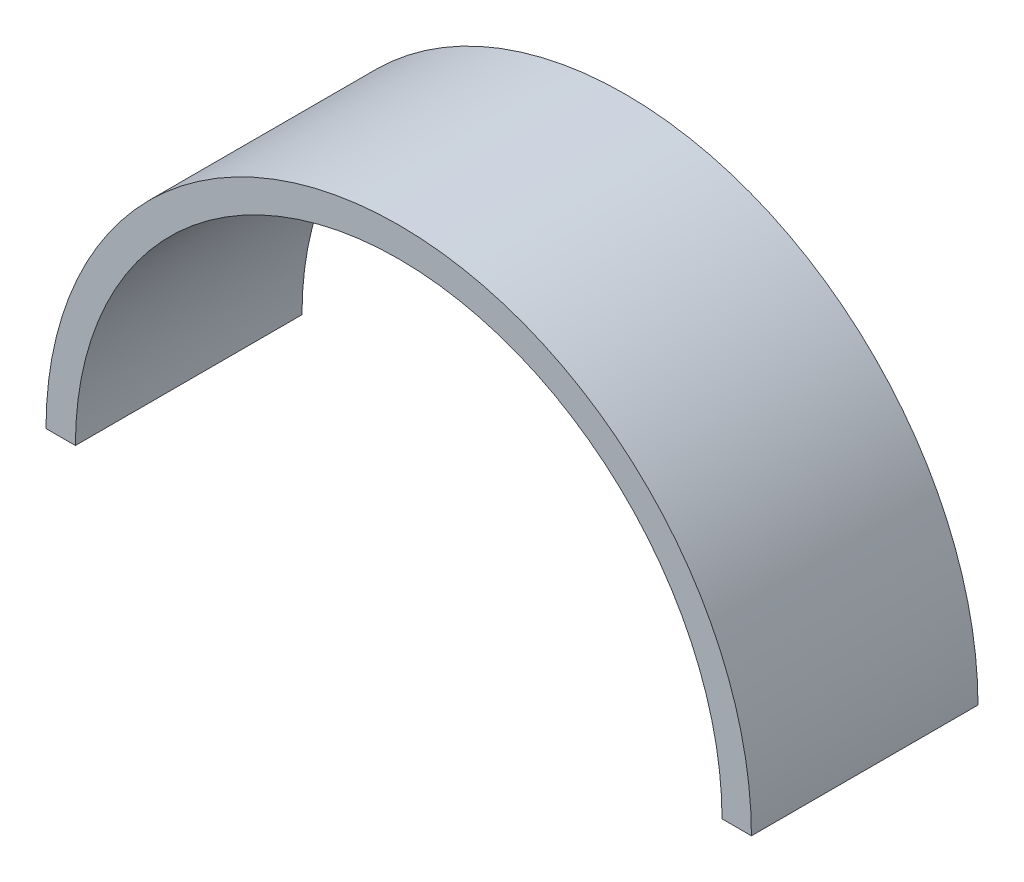
ISO-10303-21;
HEADER;
FILE_DESCRIPTION(('STEP AP214'),'2;1');
FILE_NAME('part.step','',(''),(''),'','','');
FILE_SCHEMA(('AUTOMOTIVE_DESIGN { 1 0 10303 214 1 1 1 1 }'));
ENDSEC;
DATA;
#1=APPLICATION_CONTEXT('core data for automotive mechanical design processes');
#2=APPLICATION_PROTOCOL_DEFINITION('international standard','automotive_design',2000,#1);
#3=PRODUCT_CONTEXT('',#1,'mechanical');
#4=PRODUCT('Part','Part','',(#3));
#5=PRODUCT_RELATED_PRODUCT_CATEGORY('part','',(#4));
#6=PRODUCT_DEFINITION_FORMATION('','',#4);
#7=PRODUCT_DEFINITION_CONTEXT('part definition',#1,'design');
#8=PRODUCT_DEFINITION('design','',#6,#7);
#9=PRODUCT_DEFINITION_SHAPE('','',#8);
#10=(LENGTH_UNIT() NAMED_UNIT(*) SI_UNIT(.MILLI.,.METRE.));
#11=(NAMED_UNIT(*) PLANE_ANGLE_UNIT() SI_UNIT($,.RADIAN.));
#12=(NAMED_UNIT(*) SI_UNIT($,.STERADIAN.) SOLID_ANGLE_UNIT());
#13=UNCERTAINTY_MEASURE_WITH_UNIT(LENGTH_MEASURE(1.E-05),#10,'distance_accuracy_value','');
#14=(GEOMETRIC_REPRESENTATION_CONTEXT(3) GLOBAL_UNCERTAINTY_ASSIGNED_CONTEXT((#13)) GLOBAL_UNIT_ASSIGNED_CONTEXT((#10,
#11,#12)) REPRESENTATION_CONTEXT('',''));
#15=CARTESIAN_POINT('',(0.,0.,0.));
#16=DIRECTION('',(0.,0.,1.));
#17=DIRECTION('',(1.,0.,0.));
#18=AXIS2_PLACEMENT_3D('',#15,#16,#17);
#19=CARTESIAN_POINT('',(0.,0.,18.5));
#20=DIRECTION('',(0.,0.,-1.));
#21=DIRECTION('',(-1.,0.,0.));
#22=AXIS2_PLACEMENT_3D('',#19,#20,#21);
#23=CYLINDRICAL_SURFACE('',#22,26.4);
#24=CARTESIAN_POINT('',(0.,0.,0.));
#25=DIRECTION('',(0.,0.,-1.));
#26=DIRECTION('',(1.,0.,0.));
#27=AXIS2_PLACEMENT_3D('',#24,#25,#26);
#28=CIRCLE('',#27,26.4);
#29=CARTESIAN_POINT('',(-26.4,0.,0.));
#30=VERTEX_POINT('',#29);
#31=CARTESIAN_POINT('',(26.4,0.,0.));
#32=VERTEX_POINT('',#31);
#33=EDGE_CURVE('E98',#30,#32,#28,.T.);
#34=ORIENTED_EDGE('',*,*,#33,.T.);
#35=DIRECTION('',(0.,0.,-1.));
#36=VECTOR('',#35,1.);
#37=CARTESIAN_POINT('',(26.4,0.,18.5));
#38=LINE('',#37,#36);
#39=CARTESIAN_POINT('',(26.4,0.,18.5));
#40=VERTEX_POINT('',#39);
#41=EDGE_CURVE('E11',#40,#32,#38,.T.);
#42=ORIENTED_EDGE('',*,*,#41,.F.);
#43=CARTESIAN_POINT('',(0.,0.,18.5));
#44=DIRECTION('',(0.,0.,-1.));
#45=DIRECTION('',(1.,0.,0.));
#46=AXIS2_PLACEMENT_3D('',#43,#44,#45);
#47=CIRCLE('',#46,26.4);
#48=CARTESIAN_POINT('',(-26.4,0.,18.5));
#49=VERTEX_POINT('',#48);
#50=EDGE_CURVE('E86',#49,#40,#47,.T.);
#51=ORIENTED_EDGE('',*,*,#50,.F.);
#52=DIRECTION('',(0.,0.,-1.));
#53=VECTOR('',#52,1.);
#54=CARTESIAN_POINT('',(-26.4,0.,18.5));
#55=LINE('',#54,#53);
#56=EDGE_CURVE('E94',#49,#30,#55,.T.);
#57=ORIENTED_EDGE('',*,*,#56,.T.);
#58=EDGE_LOOP('',(#34,#42,#51,#57));
#59=FACE_BOUND('',#58,.T.);
#60=ADVANCED_FACE('F35',(#59),#23,.F.);
#61=CARTESIAN_POINT('',(26.4,0.,18.5));
#62=DIRECTION('',(0.,1.,0.));
#63=DIRECTION('',(-1.,0.,0.));
#64=AXIS2_PLACEMENT_3D('',#61,#62,#63);
#65=PLANE('',#64);
#66=DIRECTION('',(1.,0.,0.));
#67=VECTOR('',#66,1.);
#68=CARTESIAN_POINT('',(26.4,0.,0.));
#69=LINE('',#68,#67);
#70=CARTESIAN_POINT('',(28.8,0.,0.));
#71=VERTEX_POINT('',#70);
#72=EDGE_CURVE('E90',#32,#71,#69,.T.);
#73=ORIENTED_EDGE('',*,*,#72,.T.);
#74=DIRECTION('',(0.,0.,-1.));
#75=VECTOR('',#74,1.);
#76=CARTESIAN_POINT('',(28.8,0.,18.5));
#77=LINE('',#76,#75);
#78=CARTESIAN_POINT('',(28.8,0.,18.5));
#79=VERTEX_POINT('',#78);
#80=EDGE_CURVE('E43',#79,#71,#77,.T.);
#81=ORIENTED_EDGE('',*,*,#80,.F.);
#82=DIRECTION('',(1.,0.,0.));
#83=VECTOR('',#82,1.);
#84=CARTESIAN_POINT('',(26.4,0.,18.5));
#85=LINE('',#84,#83);
#86=EDGE_CURVE('E81',#40,#79,#85,.T.);
#87=ORIENTED_EDGE('',*,*,#86,.F.);
#88=ORIENTED_EDGE('',*,*,#41,.T.);
#89=EDGE_LOOP('',(#73,#81,#87,#88));
#90=FACE_BOUND('',#89,.T.);
#91=ADVANCED_FACE('F89',(#90),#65,.F.);
#92=CARTESIAN_POINT('',(0.,0.,18.5));
#93=DIRECTION('',(0.,0.,-1.));
#94=DIRECTION('',(-1.,0.,0.));
#95=AXIS2_PLACEMENT_3D('',#92,#93,#94);
#96=CYLINDRICAL_SURFACE('',#95,28.8);
#97=CARTESIAN_POINT('',(0.,0.,0.));
#98=DIRECTION('',(0.,0.,1.));
#99=DIRECTION('',(1.,0.,0.));
#100=AXIS2_PLACEMENT_3D('',#97,#98,#99);
#101=CIRCLE('',#100,28.8);
#102=CARTESIAN_POINT('',(-28.8,0.,0.));
#103=VERTEX_POINT('',#102);
#104=EDGE_CURVE('E68',#71,#103,#101,.T.);
#105=ORIENTED_EDGE('',*,*,#104,.T.);
#106=DIRECTION('',(0.,0.,-1.));
#107=VECTOR('',#106,1.);
#108=CARTESIAN_POINT('',(-28.8,0.,18.5));
#109=LINE('',#108,#107);
#110=CARTESIAN_POINT('',(-28.8,0.,18.5));
#111=VERTEX_POINT('',#110);
#112=EDGE_CURVE('E91',#111,#103,#109,.T.);
#113=ORIENTED_EDGE('',*,*,#112,.F.);
#114=CARTESIAN_POINT('',(0.,0.,18.5));
#115=DIRECTION('',(0.,0.,1.));
#116=DIRECTION('',(1.,0.,0.));
#117=AXIS2_PLACEMENT_3D('',#114,#115,#116);
#118=CIRCLE('',#117,28.8);
#119=EDGE_CURVE('E84',#79,#111,#118,.T.);
#120=ORIENTED_EDGE('',*,*,#119,.F.);
#121=ORIENTED_EDGE('',*,*,#80,.T.);
#122=EDGE_LOOP('',(#105,#113,#120,#121));
#123=FACE_BOUND('',#122,.T.);
#124=ADVANCED_FACE('F92',(#123),#96,.T.);
#125=CARTESIAN_POINT('',(-26.4,0.,18.5));
#126=DIRECTION('',(0.,1.,0.));
#127=DIRECTION('',(-1.,0.,0.));
#128=AXIS2_PLACEMENT_3D('',#125,#126,#127);
#129=PLANE('',#128);
#130=DIRECTION('',(1.,0.,0.));
#131=VECTOR('',#130,1.);
#132=CARTESIAN_POINT('',(-26.4,0.,0.));
#133=LINE('',#132,#131);
#134=EDGE_CURVE('E74',#103,#30,#133,.T.);
#135=ORIENTED_EDGE('',*,*,#134,.T.);
#136=ORIENTED_EDGE('',*,*,#56,.F.);
#137=DIRECTION('',(1.,0.,0.));
#138=VECTOR('',#137,1.);
#139=CARTESIAN_POINT('',(-26.4,0.,18.5));
#140=LINE('',#139,#138);
#141=EDGE_CURVE('E51',#111,#49,#140,.T.);
#142=ORIENTED_EDGE('',*,*,#141,.F.);
#143=ORIENTED_EDGE('',*,*,#112,.T.);
#144=EDGE_LOOP('',(#135,#136,#142,#143));
#145=FACE_BOUND('',#144,.T.);
#146=ADVANCED_FACE('F105',(#145),#129,.F.);
#147=CARTESIAN_POINT('',(0.,0.,18.5));
#148=DIRECTION('',(0.,0.,1.));
#149=DIRECTION('',(1.,0.,0.));
#150=AXIS2_PLACEMENT_3D('',#147,#148,#149);
#151=PLANE('',#150);
#152=ORIENTED_EDGE('',*,*,#50,.T.);
#153=ORIENTED_EDGE('',*,*,#86,.T.);
#154=ORIENTED_EDGE('',*,*,#119,.T.);
#155=ORIENTED_EDGE('',*,*,#141,.T.);
#156=EDGE_LOOP('',(#152,#153,#154,#155));
#157=FACE_BOUND('',#156,.T.);
#158=ADVANCED_FACE('F82',(#157),#151,.T.);
#159=CARTESIAN_POINT('',(0.,0.,0.));
#160=DIRECTION('',(0.,0.,1.));
#161=DIRECTION('',(1.,0.,0.));
#162=AXIS2_PLACEMENT_3D('',#159,#160,#161);
#163=PLANE('',#162);
#164=ORIENTED_EDGE('',*,*,#33,.F.);
#165=ORIENTED_EDGE('',*,*,#134,.F.);
#166=ORIENTED_EDGE('',*,*,#104,.F.);
#167=ORIENTED_EDGE('',*,*,#72,.F.);
#168=EDGE_LOOP('',(#164,#165,#166,#167));
#169=FACE_BOUND('',#168,.T.);
#170=ADVANCED_FACE('F108',(#169),#163,.F.);
#171=CLOSED_SHELL('',(#60,#91,#124,#146,#158,#170));
#172=MANIFOLD_SOLID_BREP('B2',#171);
#173=ADVANCED_BREP_SHAPE_REPRESENTATION('',(#18,#172),#14);
#174=SHAPE_DEFINITION_REPRESENTATION(#9,#173);
ENDSEC;
END-ISO-10303-21;
